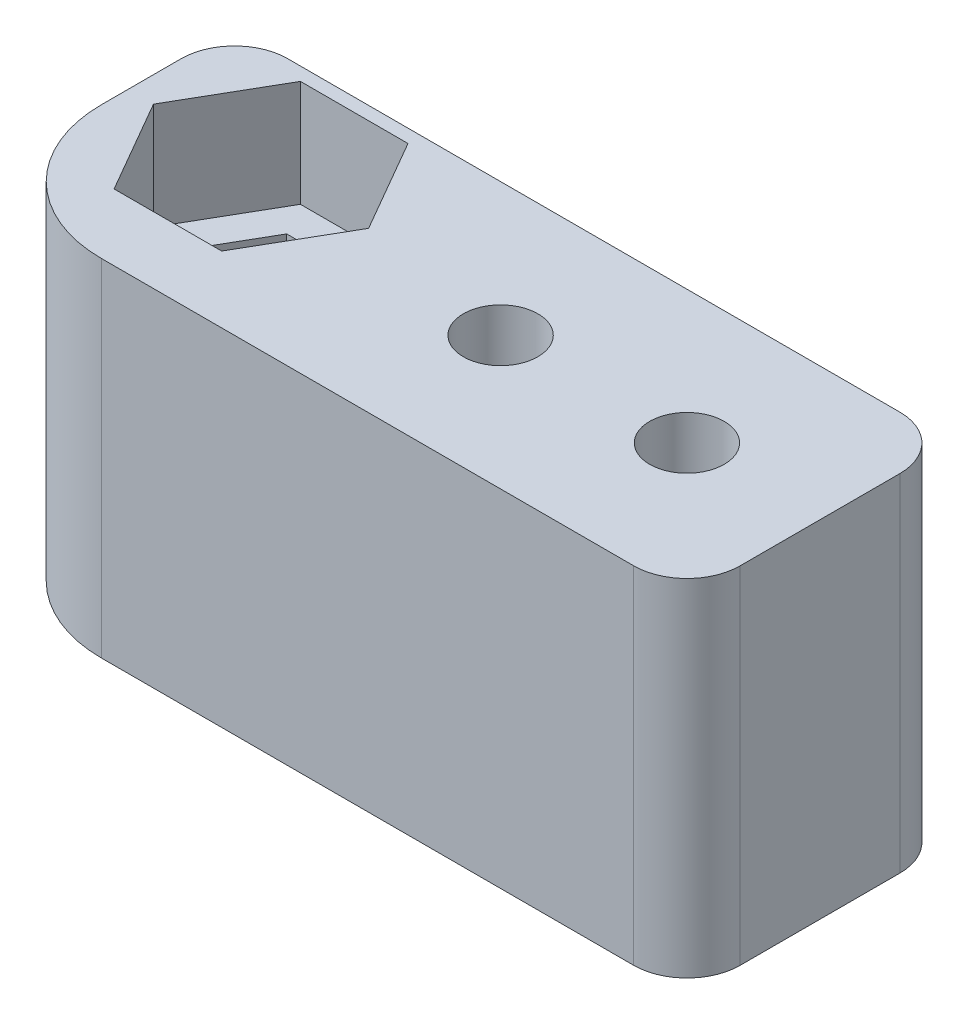
ISO-10303-21;
HEADER;
FILE_DESCRIPTION(('STEP AP214'),'2;1');
FILE_NAME('part.step','',(''),(''),'','','');
FILE_SCHEMA(('AUTOMOTIVE_DESIGN { 1 0 10303 214 1 1 1 1 }'));
ENDSEC;
DATA;
#1=APPLICATION_CONTEXT('core data for automotive mechanical design processes');
#2=APPLICATION_PROTOCOL_DEFINITION('international standard','automotive_design',2000,#1);
#3=PRODUCT_CONTEXT('',#1,'mechanical');
#4=PRODUCT('Part','Part','',(#3));
#5=PRODUCT_RELATED_PRODUCT_CATEGORY('part','',(#4));
#6=PRODUCT_DEFINITION_FORMATION('','',#4);
#7=PRODUCT_DEFINITION_CONTEXT('part definition',#1,'design');
#8=PRODUCT_DEFINITION('design','',#6,#7);
#9=PRODUCT_DEFINITION_SHAPE('','',#8);
#10=(LENGTH_UNIT() NAMED_UNIT(*) SI_UNIT(.MILLI.,.METRE.));
#11=(NAMED_UNIT(*) PLANE_ANGLE_UNIT() SI_UNIT($,.RADIAN.));
#12=(NAMED_UNIT(*) SI_UNIT($,.STERADIAN.) SOLID_ANGLE_UNIT());
#13=UNCERTAINTY_MEASURE_WITH_UNIT(LENGTH_MEASURE(1.E-05),#10,'distance_accuracy_value','');
#14=(GEOMETRIC_REPRESENTATION_CONTEXT(3) GLOBAL_UNCERTAINTY_ASSIGNED_CONTEXT((#13)) GLOBAL_UNIT_ASSIGNED_CONTEXT((#10,
#11,#12)) REPRESENTATION_CONTEXT('',''));
#15=CARTESIAN_POINT('',(0.,0.,0.));
#16=DIRECTION('',(0.,0.,1.));
#17=DIRECTION('',(1.,0.,0.));
#18=AXIS2_PLACEMENT_3D('',#15,#16,#17);
#19=CARTESIAN_POINT('',(-12.7,16.51,-1.27));
#20=DIRECTION('',(0.,-1.,0.));
#21=DIRECTION('',(0.,0.,-1.));
#22=AXIS2_PLACEMENT_3D('',#19,#20,#21);
#23=CYLINDRICAL_SURFACE('',#22,2.286);
#24=CARTESIAN_POINT('',(-12.7,0.,-1.27));
#25=DIRECTION('',(0.,1.,0.));
#26=DIRECTION('',(0.,0.,1.));
#27=AXIS2_PLACEMENT_3D('',#24,#25,#26);
#28=CIRCLE('',#27,2.286);
#29=CARTESIAN_POINT('',(-12.7,0.,1.016));
#30=VERTEX_POINT('',#29);
#31=EDGE_CURVE('E318',#30,#30,#28,.T.);
#32=ORIENTED_EDGE('',*,*,#31,.F.);
#33=EDGE_LOOP('',(#32));
#34=FACE_BOUND('',#33,.T.);
#35=CARTESIAN_POINT('',(-12.7,2.54,-1.27));
#36=DIRECTION('',(0.,1.,0.));
#37=DIRECTION('',(0.,0.,1.));
#38=AXIS2_PLACEMENT_3D('',#35,#36,#37);
#39=CIRCLE('',#38,2.286);
#40=CARTESIAN_POINT('',(-12.7,2.54,1.016));
#41=VERTEX_POINT('',#40);
#42=EDGE_CURVE('E49',#41,#41,#39,.T.);
#43=ORIENTED_EDGE('',*,*,#42,.T.);
#44=EDGE_LOOP('',(#43));
#45=FACE_BOUND('',#44,.T.);
#46=ADVANCED_FACE('F45',(#34,#45),#23,.F.);
#47=CARTESIAN_POINT('',(0.,16.51,0.));
#48=DIRECTION('',(0.,1.,0.));
#49=DIRECTION('',(0.,0.,1.));
#50=AXIS2_PLACEMENT_3D('',#47,#48,#49);
#51=PLANE('',#50);
#52=DIRECTION('',(0.5,0.,-0.866025403784439));
#53=VECTOR('',#52,1.);
#54=CARTESIAN_POINT('',(-10.1336780534521,16.51,3.175));
#55=LINE('',#54,#53);
#56=CARTESIAN_POINT('',(-10.1336780534521,16.51,3.175));
#57=VERTEX_POINT('',#56);
#58=CARTESIAN_POINT('',(-7.56735610690422,16.51,-1.27));
#59=VERTEX_POINT('',#58);
#60=EDGE_CURVE('E70',#57,#59,#55,.T.);
#61=ORIENTED_EDGE('',*,*,#60,.F.);
#62=DIRECTION('',(1.,0.,0.));
#63=VECTOR('',#62,1.);
#64=CARTESIAN_POINT('',(-15.2663219465479,16.51,3.175));
#65=LINE('',#64,#63);
#66=CARTESIAN_POINT('',(-15.2663219465479,16.51,3.175));
#67=VERTEX_POINT('',#66);
#68=EDGE_CURVE('E246',#67,#57,#65,.T.);
#69=ORIENTED_EDGE('',*,*,#68,.F.);
#70=DIRECTION('',(0.5,0.,0.866025403784439));
#71=VECTOR('',#70,1.);
#72=CARTESIAN_POINT('',(-17.8326438930958,16.51,-1.27));
#73=LINE('',#72,#71);
#74=CARTESIAN_POINT('',(-17.8326438930958,16.51,-1.27));
#75=VERTEX_POINT('',#74);
#76=EDGE_CURVE('E281',#75,#67,#73,.T.);
#77=ORIENTED_EDGE('',*,*,#76,.F.);
#78=DIRECTION('',(-0.5,0.,0.866025403784439));
#79=VECTOR('',#78,1.);
#80=CARTESIAN_POINT('',(-15.2663219465479,16.51,-5.715));
#81=LINE('',#80,#79);
#82=CARTESIAN_POINT('',(-15.2663219465479,16.51,-5.715));
#83=VERTEX_POINT('',#82);
#84=EDGE_CURVE('E277',#83,#75,#81,.T.);
#85=ORIENTED_EDGE('',*,*,#84,.F.);
#86=DIRECTION('',(-1.,0.,0.));
#87=VECTOR('',#86,1.);
#88=CARTESIAN_POINT('',(-10.1336780534521,16.51,-5.715));
#89=LINE('',#88,#87);
#90=CARTESIAN_POINT('',(-10.1336780534521,16.51,-5.715));
#91=VERTEX_POINT('',#90);
#92=EDGE_CURVE('E273',#91,#83,#89,.T.);
#93=ORIENTED_EDGE('',*,*,#92,.F.);
#94=DIRECTION('',(-0.5,0.,-0.866025403784439));
#95=VECTOR('',#94,1.);
#96=CARTESIAN_POINT('',(-7.56735610690422,16.51,-1.27));
#97=LINE('',#96,#95);
#98=EDGE_CURVE('E269',#59,#91,#97,.T.);
#99=ORIENTED_EDGE('',*,*,#98,.F.);
#100=EDGE_LOOP('',(#61,#69,#77,#85,#93,#99));
#101=FACE_BOUND('',#100,.T.);
#102=CARTESIAN_POINT('',(0.,16.51,0.));
#103=DIRECTION('',(0.,1.,0.));
#104=DIRECTION('',(0.,0.,1.));
#105=AXIS2_PLACEMENT_3D('',#102,#103,#104);
#106=CIRCLE('',#105,1.778);
#107=CARTESIAN_POINT('',(0.,16.51,1.778));
#108=VERTEX_POINT('',#107);
#109=EDGE_CURVE('E314',#108,#108,#106,.T.);
#110=ORIENTED_EDGE('',*,*,#109,.F.);
#111=EDGE_LOOP('',(#110));
#112=FACE_BOUND('',#111,.T.);
#113=DIRECTION('',(0.,0.,1.));
#114=VECTOR('',#113,1.);
#115=CARTESIAN_POINT('',(-19.05,16.51,-6.35));
#116=LINE('',#115,#114);
#117=CARTESIAN_POINT('',(-19.05,16.51,-3.81));
#118=VERTEX_POINT('',#117);
#119=CARTESIAN_POINT('',(-19.05,16.51,0.));
#120=VERTEX_POINT('',#119);
#121=EDGE_CURVE('E326',#118,#120,#116,.T.);
#122=ORIENTED_EDGE('',*,*,#121,.T.);
#123=CARTESIAN_POINT('',(-12.7,16.51,0.));
#124=DIRECTION('',(0.,1.,0.));
#125=DIRECTION('',(0.,0.,1.));
#126=AXIS2_PLACEMENT_3D('',#123,#124,#125);
#127=CIRCLE('',#126,6.35);
#128=CARTESIAN_POINT('',(-12.7,16.51,6.35));
#129=VERTEX_POINT('',#128);
#130=EDGE_CURVE('E12',#120,#129,#127,.T.);
#131=ORIENTED_EDGE('',*,*,#130,.T.);
#132=DIRECTION('',(1.,0.,0.));
#133=VECTOR('',#132,1.);
#134=CARTESIAN_POINT('',(-19.05,16.51,6.35));
#135=LINE('',#134,#133);
#136=CARTESIAN_POINT('',(12.7,16.51,6.35));
#137=VERTEX_POINT('',#136);
#138=EDGE_CURVE('E330',#129,#137,#135,.T.);
#139=ORIENTED_EDGE('',*,*,#138,.T.);
#140=CARTESIAN_POINT('',(12.7,16.51,3.81));
#141=DIRECTION('',(0.,1.,0.));
#142=DIRECTION('',(0.,0.,1.));
#143=AXIS2_PLACEMENT_3D('',#140,#141,#142);
#144=CIRCLE('',#143,2.54);
#145=CARTESIAN_POINT('',(15.24,16.51,3.81));
#146=VERTEX_POINT('',#145);
#147=EDGE_CURVE('E376',#137,#146,#144,.T.);
#148=ORIENTED_EDGE('',*,*,#147,.T.);
#149=DIRECTION('',(0.,0.,-1.));
#150=VECTOR('',#149,1.);
#151=CARTESIAN_POINT('',(15.24,16.51,-6.35));
#152=LINE('',#151,#150);
#153=CARTESIAN_POINT('',(15.24,16.51,-3.81));
#154=VERTEX_POINT('',#153);
#155=EDGE_CURVE('E334',#146,#154,#152,.T.);
#156=ORIENTED_EDGE('',*,*,#155,.T.);
#157=CARTESIAN_POINT('',(12.7,16.51,-3.81));
#158=DIRECTION('',(0.,1.,0.));
#159=DIRECTION('',(0.,0.,1.));
#160=AXIS2_PLACEMENT_3D('',#157,#158,#159);
#161=CIRCLE('',#160,2.54);
#162=CARTESIAN_POINT('',(12.7,16.51,-6.35));
#163=VERTEX_POINT('',#162);
#164=EDGE_CURVE('E379',#154,#163,#161,.T.);
#165=ORIENTED_EDGE('',*,*,#164,.T.);
#166=DIRECTION('',(-1.,0.,0.));
#167=VECTOR('',#166,1.);
#168=CARTESIAN_POINT('',(-19.05,16.51,-6.35));
#169=LINE('',#168,#167);
#170=CARTESIAN_POINT('',(-16.51,16.51,-6.35));
#171=VERTEX_POINT('',#170);
#172=EDGE_CURVE('E338',#163,#171,#169,.T.);
#173=ORIENTED_EDGE('',*,*,#172,.T.);
#174=CARTESIAN_POINT('',(-16.51,16.51,-3.81));
#175=DIRECTION('',(0.,1.,0.));
#176=DIRECTION('',(0.,0.,1.));
#177=AXIS2_PLACEMENT_3D('',#174,#175,#176);
#178=CIRCLE('',#177,2.54);
#179=EDGE_CURVE('E382',#171,#118,#178,.T.);
#180=ORIENTED_EDGE('',*,*,#179,.T.);
#181=EDGE_LOOP('',(#122,#131,#139,#148,#156,#165,#173,#180));
#182=FACE_BOUND('',#181,.T.);
#183=CARTESIAN_POINT('',(8.89,16.51,0.));
#184=DIRECTION('',(0.,1.,0.));
#185=DIRECTION('',(0.,0.,1.));
#186=AXIS2_PLACEMENT_3D('',#183,#184,#185);
#187=CIRCLE('',#186,1.778);
#188=CARTESIAN_POINT('',(8.89,16.51,1.778));
#189=VERTEX_POINT('',#188);
#190=EDGE_CURVE('E306',#189,#189,#187,.T.);
#191=ORIENTED_EDGE('',*,*,#190,.F.);
#192=EDGE_LOOP('',(#191));
#193=FACE_BOUND('',#192,.T.);
#194=ADVANCED_FACE('F413',(#101,#112,#182,#193),#51,.T.);
#195=CARTESIAN_POINT('',(0.,0.,0.));
#196=DIRECTION('',(0.,1.,0.));
#197=DIRECTION('',(0.,0.,1.));
#198=AXIS2_PLACEMENT_3D('',#195,#196,#197);
#199=PLANE('',#198);
#200=DIRECTION('',(1.,0.,0.));
#201=VECTOR('',#200,1.);
#202=CARTESIAN_POINT('',(-19.05,0.,6.35));
#203=LINE('',#202,#201);
#204=CARTESIAN_POINT('',(-12.7,0.,6.35));
#205=VERTEX_POINT('',#204);
#206=CARTESIAN_POINT('',(12.7,0.,6.35));
#207=VERTEX_POINT('',#206);
#208=EDGE_CURVE('E346',#205,#207,#203,.T.);
#209=ORIENTED_EDGE('',*,*,#208,.F.);
#210=CARTESIAN_POINT('',(-12.7,0.,0.));
#211=DIRECTION('',(0.,1.,0.));
#212=DIRECTION('',(0.,0.,1.));
#213=AXIS2_PLACEMENT_3D('',#210,#211,#212);
#214=CIRCLE('',#213,6.35);
#215=CARTESIAN_POINT('',(-19.05,0.,0.));
#216=VERTEX_POINT('',#215);
#217=EDGE_CURVE('E400',#205,#216,#214,.F.);
#218=ORIENTED_EDGE('',*,*,#217,.T.);
#219=DIRECTION('',(0.,0.,1.));
#220=VECTOR('',#219,1.);
#221=CARTESIAN_POINT('',(-19.05,0.,-6.35));
#222=LINE('',#221,#220);
#223=CARTESIAN_POINT('',(-19.05,0.,-3.81));
#224=VERTEX_POINT('',#223);
#225=EDGE_CURVE('E325',#224,#216,#222,.T.);
#226=ORIENTED_EDGE('',*,*,#225,.F.);
#227=CARTESIAN_POINT('',(-16.51,0.,-3.81));
#228=DIRECTION('',(0.,1.,0.));
#229=DIRECTION('',(0.,0.,1.));
#230=AXIS2_PLACEMENT_3D('',#227,#228,#229);
#231=CIRCLE('',#230,2.54);
#232=CARTESIAN_POINT('',(-16.51,0.,-6.35));
#233=VERTEX_POINT('',#232);
#234=EDGE_CURVE('E366',#224,#233,#231,.F.);
#235=ORIENTED_EDGE('',*,*,#234,.T.);
#236=DIRECTION('',(-1.,0.,0.));
#237=VECTOR('',#236,1.);
#238=CARTESIAN_POINT('',(-19.05,0.,-6.35));
#239=LINE('',#238,#237);
#240=CARTESIAN_POINT('',(12.7,0.,-6.35));
#241=VERTEX_POINT('',#240);
#242=EDGE_CURVE('E331',#241,#233,#239,.T.);
#243=ORIENTED_EDGE('',*,*,#242,.F.);
#244=CARTESIAN_POINT('',(12.7,0.,-3.81));
#245=DIRECTION('',(0.,1.,0.));
#246=DIRECTION('',(0.,0.,1.));
#247=AXIS2_PLACEMENT_3D('',#244,#245,#246);
#248=CIRCLE('',#247,2.54);
#249=CARTESIAN_POINT('',(15.24,0.,-3.81));
#250=VERTEX_POINT('',#249);
#251=EDGE_CURVE('E363',#241,#250,#248,.F.);
#252=ORIENTED_EDGE('',*,*,#251,.T.);
#253=DIRECTION('',(0.,0.,-1.));
#254=VECTOR('',#253,1.);
#255=CARTESIAN_POINT('',(15.24,0.,-6.35));
#256=LINE('',#255,#254);
#257=CARTESIAN_POINT('',(15.24,0.,3.81));
#258=VERTEX_POINT('',#257);
#259=EDGE_CURVE('E349',#258,#250,#256,.T.);
#260=ORIENTED_EDGE('',*,*,#259,.F.);
#261=CARTESIAN_POINT('',(12.7,0.,3.81));
#262=DIRECTION('',(0.,1.,0.));
#263=DIRECTION('',(0.,0.,1.));
#264=AXIS2_PLACEMENT_3D('',#261,#262,#263);
#265=CIRCLE('',#264,2.54);
#266=EDGE_CURVE('E359',#258,#207,#265,.F.);
#267=ORIENTED_EDGE('',*,*,#266,.T.);
#268=EDGE_LOOP('',(#209,#218,#226,#235,#243,#252,#260,#267));
#269=FACE_BOUND('',#268,.T.);
#270=ORIENTED_EDGE('',*,*,#31,.T.);
#271=EDGE_LOOP('',(#270));
#272=FACE_BOUND('',#271,.T.);
#273=CARTESIAN_POINT('',(0.,0.,0.));
#274=DIRECTION('',(0.,1.,0.));
#275=DIRECTION('',(0.,0.,1.));
#276=AXIS2_PLACEMENT_3D('',#273,#274,#275);
#277=CIRCLE('',#276,1.778);
#278=CARTESIAN_POINT('',(0.,0.,1.778));
#279=VERTEX_POINT('',#278);
#280=EDGE_CURVE('E310',#279,#279,#277,.T.);
#281=ORIENTED_EDGE('',*,*,#280,.T.);
#282=EDGE_LOOP('',(#281));
#283=FACE_BOUND('',#282,.T.);
#284=CARTESIAN_POINT('',(8.89,0.,0.));
#285=DIRECTION('',(0.,1.,0.));
#286=DIRECTION('',(0.,0.,1.));
#287=AXIS2_PLACEMENT_3D('',#284,#285,#286);
#288=CIRCLE('',#287,1.778);
#289=CARTESIAN_POINT('',(8.89,0.,1.778));
#290=VERTEX_POINT('',#289);
#291=EDGE_CURVE('E291',#290,#290,#288,.T.);
#292=ORIENTED_EDGE('',*,*,#291,.T.);
#293=EDGE_LOOP('',(#292));
#294=FACE_BOUND('',#293,.T.);
#295=ADVANCED_FACE('F422',(#269,#272,#283,#294),#199,.F.);
#296=CARTESIAN_POINT('',(-19.05,16.51,-6.35));
#297=DIRECTION('',(1.,0.,0.));
#298=DIRECTION('',(0.,0.,-1.));
#299=AXIS2_PLACEMENT_3D('',#296,#297,#298);
#300=PLANE('',#299);
#301=ORIENTED_EDGE('',*,*,#225,.T.);
#302=DIRECTION('',(0.,-1.,0.));
#303=VECTOR('',#302,1.);
#304=CARTESIAN_POINT('',(-19.05,16.51,0.));
#305=LINE('',#304,#303);
#306=EDGE_CURVE('E55',#216,#120,#305,.F.);
#307=ORIENTED_EDGE('',*,*,#306,.T.);
#308=ORIENTED_EDGE('',*,*,#121,.F.);
#309=DIRECTION('',(0.,-1.,0.));
#310=VECTOR('',#309,1.);
#311=CARTESIAN_POINT('',(-19.05,16.51,-3.81));
#312=LINE('',#311,#310);
#313=EDGE_CURVE('E342',#118,#224,#312,.T.);
#314=ORIENTED_EDGE('',*,*,#313,.T.);
#315=EDGE_LOOP('',(#301,#307,#308,#314));
#316=FACE_BOUND('',#315,.T.);
#317=ADVANCED_FACE('F407',(#316),#300,.F.);
#318=CARTESIAN_POINT('',(-19.05,16.51,6.35));
#319=DIRECTION('',(0.,0.,-1.));
#320=DIRECTION('',(-1.,0.,0.));
#321=AXIS2_PLACEMENT_3D('',#318,#319,#320);
#322=PLANE('',#321);
#323=ORIENTED_EDGE('',*,*,#138,.F.);
#324=DIRECTION('',(0.,-1.,0.));
#325=VECTOR('',#324,1.);
#326=CARTESIAN_POINT('',(-12.7,16.51,6.35));
#327=LINE('',#326,#325);
#328=EDGE_CURVE('E396',#129,#205,#327,.T.);
#329=ORIENTED_EDGE('',*,*,#328,.T.);
#330=ORIENTED_EDGE('',*,*,#208,.T.);
#331=DIRECTION('',(0.,-1.,0.));
#332=VECTOR('',#331,1.);
#333=CARTESIAN_POINT('',(12.7,16.51,6.35));
#334=LINE('',#333,#332);
#335=EDGE_CURVE('E392',#207,#137,#334,.F.);
#336=ORIENTED_EDGE('',*,*,#335,.T.);
#337=EDGE_LOOP('',(#323,#329,#330,#336));
#338=FACE_BOUND('',#337,.T.);
#339=ADVANCED_FACE('F420',(#338),#322,.F.);
#340=CARTESIAN_POINT('',(15.24,16.51,-6.35));
#341=DIRECTION('',(-1.,0.,0.));
#342=DIRECTION('',(0.,0.,1.));
#343=AXIS2_PLACEMENT_3D('',#340,#341,#342);
#344=PLANE('',#343);
#345=ORIENTED_EDGE('',*,*,#259,.T.);
#346=DIRECTION('',(0.,-1.,0.));
#347=VECTOR('',#346,1.);
#348=CARTESIAN_POINT('',(15.24,16.51,-3.81));
#349=LINE('',#348,#347);
#350=EDGE_CURVE('E389',#250,#154,#349,.F.);
#351=ORIENTED_EDGE('',*,*,#350,.T.);
#352=ORIENTED_EDGE('',*,*,#155,.F.);
#353=DIRECTION('',(0.,-1.,0.));
#354=VECTOR('',#353,1.);
#355=CARTESIAN_POINT('',(15.24,16.51,3.81));
#356=LINE('',#355,#354);
#357=EDGE_CURVE('E385',#146,#258,#356,.T.);
#358=ORIENTED_EDGE('',*,*,#357,.T.);
#359=EDGE_LOOP('',(#345,#351,#352,#358));
#360=FACE_BOUND('',#359,.T.);
#361=ADVANCED_FACE('F433',(#360),#344,.F.);
#362=CARTESIAN_POINT('',(-19.05,16.51,-6.35));
#363=DIRECTION('',(0.,0.,1.));
#364=DIRECTION('',(1.,0.,0.));
#365=AXIS2_PLACEMENT_3D('',#362,#363,#364);
#366=PLANE('',#365);
#367=ORIENTED_EDGE('',*,*,#242,.T.);
#368=DIRECTION('',(0.,-1.,0.));
#369=VECTOR('',#368,1.);
#370=CARTESIAN_POINT('',(-16.51,16.51,-6.35));
#371=LINE('',#370,#369);
#372=EDGE_CURVE('E373',#233,#171,#371,.F.);
#373=ORIENTED_EDGE('',*,*,#372,.T.);
#374=ORIENTED_EDGE('',*,*,#172,.F.);
#375=DIRECTION('',(0.,-1.,0.));
#376=VECTOR('',#375,1.);
#377=CARTESIAN_POINT('',(12.7,16.51,-6.35));
#378=LINE('',#377,#376);
#379=EDGE_CURVE('E369',#163,#241,#378,.T.);
#380=ORIENTED_EDGE('',*,*,#379,.T.);
#381=EDGE_LOOP('',(#367,#373,#374,#380));
#382=FACE_BOUND('',#381,.T.);
#383=ADVANCED_FACE('F440',(#382),#366,.F.);
#384=CARTESIAN_POINT('',(0.,16.51,0.));
#385=DIRECTION('',(0.,-1.,0.));
#386=DIRECTION('',(0.,0.,-1.));
#387=AXIS2_PLACEMENT_3D('',#384,#385,#386);
#388=CYLINDRICAL_SURFACE('',#387,1.778);
#389=ORIENTED_EDGE('',*,*,#109,.T.);
#390=EDGE_LOOP('',(#389));
#391=FACE_BOUND('',#390,.T.);
#392=ORIENTED_EDGE('',*,*,#280,.F.);
#393=EDGE_LOOP('',(#392));
#394=FACE_BOUND('',#393,.T.);
#395=ADVANCED_FACE('F453',(#391,#394),#388,.F.);
#396=CARTESIAN_POINT('',(8.89,16.51,0.));
#397=DIRECTION('',(0.,-1.,0.));
#398=DIRECTION('',(0.,0.,-1.));
#399=AXIS2_PLACEMENT_3D('',#396,#397,#398);
#400=CYLINDRICAL_SURFACE('',#399,1.778);
#401=ORIENTED_EDGE('',*,*,#190,.T.);
#402=EDGE_LOOP('',(#401));
#403=FACE_BOUND('',#402,.T.);
#404=ORIENTED_EDGE('',*,*,#291,.F.);
#405=EDGE_LOOP('',(#404));
#406=FACE_BOUND('',#405,.T.);
#407=ADVANCED_FACE('F446',(#403,#406),#400,.F.);
#408=CARTESIAN_POINT('',(-16.51,16.51,-3.81));
#409=DIRECTION('',(0.,-1.,0.));
#410=DIRECTION('',(0.,0.,-1.));
#411=AXIS2_PLACEMENT_3D('',#408,#409,#410);
#412=CYLINDRICAL_SURFACE('',#411,2.54);
#413=ORIENTED_EDGE('',*,*,#179,.F.);
#414=ORIENTED_EDGE('',*,*,#372,.F.);
#415=ORIENTED_EDGE('',*,*,#234,.F.);
#416=ORIENTED_EDGE('',*,*,#313,.F.);
#417=EDGE_LOOP('',(#413,#414,#415,#416));
#418=FACE_BOUND('',#417,.T.);
#419=ADVANCED_FACE('F444',(#418),#412,.T.);
#420=CARTESIAN_POINT('',(12.7,16.51,-3.81));
#421=DIRECTION('',(0.,-1.,0.));
#422=DIRECTION('',(0.,0.,-1.));
#423=AXIS2_PLACEMENT_3D('',#420,#421,#422);
#424=CYLINDRICAL_SURFACE('',#423,2.54);
#425=ORIENTED_EDGE('',*,*,#164,.F.);
#426=ORIENTED_EDGE('',*,*,#350,.F.);
#427=ORIENTED_EDGE('',*,*,#251,.F.);
#428=ORIENTED_EDGE('',*,*,#379,.F.);
#429=EDGE_LOOP('',(#425,#426,#427,#428));
#430=FACE_BOUND('',#429,.T.);
#431=ADVANCED_FACE('F436',(#430),#424,.T.);
#432=CARTESIAN_POINT('',(12.7,16.51,3.81));
#433=DIRECTION('',(0.,-1.,0.));
#434=DIRECTION('',(0.,0.,-1.));
#435=AXIS2_PLACEMENT_3D('',#432,#433,#434);
#436=CYLINDRICAL_SURFACE('',#435,2.54);
#437=ORIENTED_EDGE('',*,*,#147,.F.);
#438=ORIENTED_EDGE('',*,*,#335,.F.);
#439=ORIENTED_EDGE('',*,*,#266,.F.);
#440=ORIENTED_EDGE('',*,*,#357,.F.);
#441=EDGE_LOOP('',(#437,#438,#439,#440));
#442=FACE_BOUND('',#441,.T.);
#443=ADVANCED_FACE('F429',(#442),#436,.T.);
#444=CARTESIAN_POINT('',(-12.7,16.51,0.));
#445=DIRECTION('',(0.,-1.,0.));
#446=DIRECTION('',(0.,0.,-1.));
#447=AXIS2_PLACEMENT_3D('',#444,#445,#446);
#448=CYLINDRICAL_SURFACE('',#447,6.35);
#449=ORIENTED_EDGE('',*,*,#130,.F.);
#450=ORIENTED_EDGE('',*,*,#306,.F.);
#451=ORIENTED_EDGE('',*,*,#217,.F.);
#452=ORIENTED_EDGE('',*,*,#328,.F.);
#453=EDGE_LOOP('',(#449,#450,#451,#452));
#454=FACE_BOUND('',#453,.T.);
#455=ADVANCED_FACE('F47',(#454),#448,.T.);
#456=CARTESIAN_POINT('',(-10.1336780534521,11.43,3.175));
#457=DIRECTION('',(0.866025403784439,0.,0.5));
#458=DIRECTION('',(0.5,0.,-0.866025403784439));
#459=AXIS2_PLACEMENT_3D('',#456,#457,#458);
#460=PLANE('',#459);
#461=ORIENTED_EDGE('',*,*,#60,.T.);
#462=DIRECTION('',(0.,1.,0.));
#463=VECTOR('',#462,1.);
#464=CARTESIAN_POINT('',(-7.56735610690422,11.43,-1.27));
#465=LINE('',#464,#463);
#466=CARTESIAN_POINT('',(-7.56735610690422,11.43,-1.27));
#467=VERTEX_POINT('',#466);
#468=EDGE_CURVE('E266',#467,#59,#465,.T.);
#469=ORIENTED_EDGE('',*,*,#468,.F.);
#470=DIRECTION('',(0.5,0.,-0.866025403784439));
#471=VECTOR('',#470,1.);
#472=CARTESIAN_POINT('',(-10.1336780534521,11.43,3.175));
#473=LINE('',#472,#471);
#474=CARTESIAN_POINT('',(-10.1336780534521,11.43,3.175));
#475=VERTEX_POINT('',#474);
#476=EDGE_CURVE('E241',#475,#467,#473,.T.);
#477=ORIENTED_EDGE('',*,*,#476,.F.);
#478=DIRECTION('',(0.,1.,0.));
#479=VECTOR('',#478,1.);
#480=CARTESIAN_POINT('',(-10.1336780534521,11.43,3.175));
#481=LINE('',#480,#479);
#482=EDGE_CURVE('E288',#475,#57,#481,.T.);
#483=ORIENTED_EDGE('',*,*,#482,.T.);
#484=EDGE_LOOP('',(#461,#469,#477,#483));
#485=FACE_BOUND('',#484,.T.);
#486=ADVANCED_FACE('F540',(#485),#460,.F.);
#487=CARTESIAN_POINT('',(-15.2663219465479,11.43,3.175));
#488=DIRECTION('',(0.,0.,1.));
#489=DIRECTION('',(1.,0.,0.));
#490=AXIS2_PLACEMENT_3D('',#487,#488,#489);
#491=PLANE('',#490);
#492=ORIENTED_EDGE('',*,*,#68,.T.);
#493=ORIENTED_EDGE('',*,*,#482,.F.);
#494=DIRECTION('',(1.,0.,0.));
#495=VECTOR('',#494,1.);
#496=CARTESIAN_POINT('',(-15.2663219465479,11.43,3.175));
#497=LINE('',#496,#495);
#498=CARTESIAN_POINT('',(-15.2663219465479,11.43,3.175));
#499=VERTEX_POINT('',#498);
#500=EDGE_CURVE('E262',#499,#475,#497,.T.);
#501=ORIENTED_EDGE('',*,*,#500,.F.);
#502=DIRECTION('',(0.,1.,0.));
#503=VECTOR('',#502,1.);
#504=CARTESIAN_POINT('',(-15.2663219465479,11.43,3.175));
#505=LINE('',#504,#503);
#506=EDGE_CURVE('E292',#499,#67,#505,.T.);
#507=ORIENTED_EDGE('',*,*,#506,.T.);
#508=EDGE_LOOP('',(#492,#493,#501,#507));
#509=FACE_BOUND('',#508,.T.);
#510=ADVANCED_FACE('F550',(#509),#491,.F.);
#511=CARTESIAN_POINT('',(-17.8326438930958,11.43,-1.27));
#512=DIRECTION('',(-0.866025403784439,0.,0.5));
#513=DIRECTION('',(0.5,0.,0.866025403784439));
#514=AXIS2_PLACEMENT_3D('',#511,#512,#513);
#515=PLANE('',#514);
#516=ORIENTED_EDGE('',*,*,#76,.T.);
#517=ORIENTED_EDGE('',*,*,#506,.F.);
#518=DIRECTION('',(0.5,0.,0.866025403784439));
#519=VECTOR('',#518,1.);
#520=CARTESIAN_POINT('',(-17.8326438930958,11.43,-1.27));
#521=LINE('',#520,#519);
#522=CARTESIAN_POINT('',(-17.8326438930958,11.43,-1.27));
#523=VERTEX_POINT('',#522);
#524=EDGE_CURVE('E258',#523,#499,#521,.T.);
#525=ORIENTED_EDGE('',*,*,#524,.F.);
#526=DIRECTION('',(0.,1.,0.));
#527=VECTOR('',#526,1.);
#528=CARTESIAN_POINT('',(-17.8326438930958,11.43,-1.27));
#529=LINE('',#528,#527);
#530=EDGE_CURVE('E295',#523,#75,#529,.T.);
#531=ORIENTED_EDGE('',*,*,#530,.T.);
#532=EDGE_LOOP('',(#516,#517,#525,#531));
#533=FACE_BOUND('',#532,.T.);
#534=ADVANCED_FACE('F560',(#533),#515,.F.);
#535=CARTESIAN_POINT('',(-15.2663219465479,11.43,-5.715));
#536=DIRECTION('',(-0.866025403784439,0.,-0.5));
#537=DIRECTION('',(-0.5,0.,0.866025403784439));
#538=AXIS2_PLACEMENT_3D('',#535,#536,#537);
#539=PLANE('',#538);
#540=ORIENTED_EDGE('',*,*,#84,.T.);
#541=ORIENTED_EDGE('',*,*,#530,.F.);
#542=DIRECTION('',(-0.5,0.,0.866025403784439));
#543=VECTOR('',#542,1.);
#544=CARTESIAN_POINT('',(-15.2663219465479,11.43,-5.715));
#545=LINE('',#544,#543);
#546=CARTESIAN_POINT('',(-15.2663219465479,11.43,-5.715));
#547=VERTEX_POINT('',#546);
#548=EDGE_CURVE('E254',#547,#523,#545,.T.);
#549=ORIENTED_EDGE('',*,*,#548,.F.);
#550=DIRECTION('',(0.,1.,0.));
#551=VECTOR('',#550,1.);
#552=CARTESIAN_POINT('',(-15.2663219465479,11.43,-5.715));
#553=LINE('',#552,#551);
#554=EDGE_CURVE('E298',#547,#83,#553,.T.);
#555=ORIENTED_EDGE('',*,*,#554,.T.);
#556=EDGE_LOOP('',(#540,#541,#549,#555));
#557=FACE_BOUND('',#556,.T.);
#558=ADVANCED_FACE('F571',(#557),#539,.F.);
#559=CARTESIAN_POINT('',(-10.1336780534521,11.43,-5.715));
#560=DIRECTION('',(0.,0.,-1.));
#561=DIRECTION('',(-1.,0.,0.));
#562=AXIS2_PLACEMENT_3D('',#559,#560,#561);
#563=PLANE('',#562);
#564=ORIENTED_EDGE('',*,*,#92,.T.);
#565=ORIENTED_EDGE('',*,*,#554,.F.);
#566=DIRECTION('',(-1.,0.,0.));
#567=VECTOR('',#566,1.);
#568=CARTESIAN_POINT('',(-10.1336780534521,11.43,-5.715));
#569=LINE('',#568,#567);
#570=CARTESIAN_POINT('',(-10.1336780534521,11.43,-5.715));
#571=VERTEX_POINT('',#570);
#572=EDGE_CURVE('E250',#571,#547,#569,.T.);
#573=ORIENTED_EDGE('',*,*,#572,.F.);
#574=DIRECTION('',(0.,1.,0.));
#575=VECTOR('',#574,1.);
#576=CARTESIAN_POINT('',(-10.1336780534521,11.43,-5.715));
#577=LINE('',#576,#575);
#578=EDGE_CURVE('E301',#571,#91,#577,.T.);
#579=ORIENTED_EDGE('',*,*,#578,.T.);
#580=EDGE_LOOP('',(#564,#565,#573,#579));
#581=FACE_BOUND('',#580,.T.);
#582=ADVANCED_FACE('F582',(#581),#563,.F.);
#583=CARTESIAN_POINT('',(-7.56735610690422,11.43,-1.27));
#584=DIRECTION('',(0.866025403784439,0.,-0.5));
#585=DIRECTION('',(-0.5,0.,-0.866025403784439));
#586=AXIS2_PLACEMENT_3D('',#583,#584,#585);
#587=PLANE('',#586);
#588=ORIENTED_EDGE('',*,*,#98,.T.);
#589=ORIENTED_EDGE('',*,*,#578,.F.);
#590=DIRECTION('',(-0.5,0.,-0.866025403784439));
#591=VECTOR('',#590,1.);
#592=CARTESIAN_POINT('',(-7.56735610690422,11.43,-1.27));
#593=LINE('',#592,#591);
#594=EDGE_CURVE('E245',#467,#571,#593,.T.);
#595=ORIENTED_EDGE('',*,*,#594,.F.);
#596=ORIENTED_EDGE('',*,*,#468,.T.);
#597=EDGE_LOOP('',(#588,#589,#595,#596));
#598=FACE_BOUND('',#597,.T.);
#599=ADVANCED_FACE('F593',(#598),#587,.F.);
#600=CARTESIAN_POINT('',(0.,11.43,0.));
#601=DIRECTION('',(0.,1.,0.));
#602=DIRECTION('',(0.,0.,1.));
#603=AXIS2_PLACEMENT_3D('',#600,#601,#602);
#604=PLANE('',#603);
#605=DIRECTION('',(0.499999999999995,0.,-0.866025403784441));
#606=VECTOR('',#605,1.);
#607=CARTESIAN_POINT('',(-11.028219466856,11.43,1.62560882250998));
#608=LINE('',#607,#606);
#609=CARTESIAN_POINT('',(-11.028219466856,11.43,1.62560882250998));
#610=VERTEX_POINT('',#609);
#611=CARTESIAN_POINT('',(-9.35643893371199,11.43,-1.27));
#612=VERTEX_POINT('',#611);
#613=EDGE_CURVE('E62',#610,#612,#608,.T.);
#614=ORIENTED_EDGE('',*,*,#613,.F.);
#615=DIRECTION('',(1.,0.,0.));
#616=VECTOR('',#615,1.);
#617=CARTESIAN_POINT('',(-14.371780533144,11.43,1.62560882251002));
#618=LINE('',#617,#616);
#619=CARTESIAN_POINT('',(-14.371780533144,11.43,1.62560882251002));
#620=VERTEX_POINT('',#619);
#621=EDGE_CURVE('E220',#620,#610,#618,.T.);
#622=ORIENTED_EDGE('',*,*,#621,.F.);
#623=DIRECTION('',(0.500000000000007,0.,0.866025403784434));
#624=VECTOR('',#623,1.);
#625=CARTESIAN_POINT('',(-16.043561066288,11.43,-1.26999999999998));
#626=LINE('',#625,#624);
#627=CARTESIAN_POINT('',(-16.043561066288,11.43,-1.26999999999998));
#628=VERTEX_POINT('',#627);
#629=EDGE_CURVE('E213',#628,#620,#626,.T.);
#630=ORIENTED_EDGE('',*,*,#629,.F.);
#631=DIRECTION('',(-0.499999999999995,0.,0.866025403784442));
#632=VECTOR('',#631,1.);
#633=CARTESIAN_POINT('',(-14.371780533144,11.43,-4.16560882251));
#634=LINE('',#633,#632);
#635=CARTESIAN_POINT('',(-14.371780533144,11.43,-4.16560882251));
#636=VERTEX_POINT('',#635);
#637=EDGE_CURVE('E209',#636,#628,#634,.T.);
#638=ORIENTED_EDGE('',*,*,#637,.F.);
#639=DIRECTION('',(-1.,0.,0.));
#640=VECTOR('',#639,1.);
#641=CARTESIAN_POINT('',(-11.028219466856,11.43,-4.16560882251001));
#642=LINE('',#641,#640);
#643=CARTESIAN_POINT('',(-11.028219466856,11.43,-4.16560882251001));
#644=VERTEX_POINT('',#643);
#645=EDGE_CURVE('E189',#644,#636,#642,.T.);
#646=ORIENTED_EDGE('',*,*,#645,.F.);
#647=DIRECTION('',(-0.500000000000001,0.,-0.866025403784438));
#648=VECTOR('',#647,1.);
#649=CARTESIAN_POINT('',(-9.35643893371199,11.43,-1.27));
#650=LINE('',#649,#648);
#651=EDGE_CURVE('E200',#612,#644,#650,.T.);
#652=ORIENTED_EDGE('',*,*,#651,.F.);
#653=EDGE_LOOP('',(#614,#622,#630,#638,#646,#652));
#654=FACE_BOUND('',#653,.T.);
#655=ORIENTED_EDGE('',*,*,#476,.T.);
#656=ORIENTED_EDGE('',*,*,#594,.T.);
#657=ORIENTED_EDGE('',*,*,#572,.T.);
#658=ORIENTED_EDGE('',*,*,#548,.T.);
#659=ORIENTED_EDGE('',*,*,#524,.T.);
#660=ORIENTED_EDGE('',*,*,#500,.T.);
#661=EDGE_LOOP('',(#655,#656,#657,#658,#659,#660));
#662=FACE_BOUND('',#661,.T.);
#663=ADVANCED_FACE('F205',(#654,#662),#604,.T.);
#664=CARTESIAN_POINT('',(-11.028219466856,-8.84623107475604,1.62560882250998));
#665=DIRECTION('',(0.866025403784441,0.,0.499999999999995));
#666=DIRECTION('',(0.499999999999995,0.,-0.866025403784442));
#667=AXIS2_PLACEMENT_3D('',#664,#665,#666);
#668=PLANE('',#667);
#669=DIRECTION('',(-0.499999999999995,0.,0.866025403784442));
#670=VECTOR('',#669,1.);
#671=CARTESIAN_POINT('',(-11.028219466856,2.54,1.62560882250998));
#672=LINE('',#671,#670);
#673=CARTESIAN_POINT('',(-9.35643893371199,2.54,-1.27));
#674=VERTEX_POINT('',#673);
#675=CARTESIAN_POINT('',(-11.028219466856,2.54,1.62560882250998));
#676=VERTEX_POINT('',#675);
#677=EDGE_CURVE('E240',#674,#676,#672,.T.);
#678=ORIENTED_EDGE('',*,*,#677,.T.);
#679=DIRECTION('',(0.,1.,0.));
#680=VECTOR('',#679,1.);
#681=CARTESIAN_POINT('',(-11.028219466856,-8.84623107475604,1.62560882250998));
#682=LINE('',#681,#680);
#683=EDGE_CURVE('E224',#676,#610,#682,.T.);
#684=ORIENTED_EDGE('',*,*,#683,.T.);
#685=ORIENTED_EDGE('',*,*,#613,.T.);
#686=DIRECTION('',(0.,1.,0.));
#687=VECTOR('',#686,1.);
#688=CARTESIAN_POINT('',(-9.35643893371199,-8.84623107475604,-1.27));
#689=LINE('',#688,#687);
#690=EDGE_CURVE('E197',#674,#612,#689,.T.);
#691=ORIENTED_EDGE('',*,*,#690,.F.);
#692=EDGE_LOOP('',(#678,#684,#685,#691));
#693=FACE_BOUND('',#692,.T.);
#694=ADVANCED_FACE('F614',(#693),#668,.F.);
#695=CARTESIAN_POINT('',(-14.371780533144,-8.84623107475604,1.62560882251002));
#696=DIRECTION('',(0.,0.,1.));
#697=DIRECTION('',(1.,0.,0.));
#698=AXIS2_PLACEMENT_3D('',#695,#696,#697);
#699=PLANE('',#698);
#700=DIRECTION('',(-1.,0.,0.));
#701=VECTOR('',#700,1.);
#702=CARTESIAN_POINT('',(-14.371780533144,2.54,1.62560882251002));
#703=LINE('',#702,#701);
#704=CARTESIAN_POINT('',(-14.371780533144,2.54,1.62560882251002));
#705=VERTEX_POINT('',#704);
#706=EDGE_CURVE('E717',#676,#705,#703,.T.);
#707=ORIENTED_EDGE('',*,*,#706,.T.);
#708=DIRECTION('',(0.,1.,0.));
#709=VECTOR('',#708,1.);
#710=CARTESIAN_POINT('',(-14.371780533144,-8.84623107475604,1.62560882251002));
#711=LINE('',#710,#709);
#712=EDGE_CURVE('E227',#705,#620,#711,.T.);
#713=ORIENTED_EDGE('',*,*,#712,.T.);
#714=ORIENTED_EDGE('',*,*,#621,.T.);
#715=ORIENTED_EDGE('',*,*,#683,.F.);
#716=EDGE_LOOP('',(#707,#713,#714,#715));
#717=FACE_BOUND('',#716,.T.);
#718=ADVANCED_FACE('F630',(#717),#699,.F.);
#719=CARTESIAN_POINT('',(-16.043561066288,-8.84623107475604,-1.26999999999998));
#720=DIRECTION('',(-0.866025403784434,0.,0.500000000000007));
#721=DIRECTION('',(0.500000000000007,0.,0.866025403784435));
#722=AXIS2_PLACEMENT_3D('',#719,#720,#721);
#723=PLANE('',#722);
#724=DIRECTION('',(-0.500000000000007,0.,-0.866025403784435));
#725=VECTOR('',#724,1.);
#726=CARTESIAN_POINT('',(-16.043561066288,2.54,-1.26999999999998));
#727=LINE('',#726,#725);
#728=CARTESIAN_POINT('',(-16.043561066288,2.54,-1.26999999999998));
#729=VERTEX_POINT('',#728);
#730=EDGE_CURVE('E722',#705,#729,#727,.T.);
#731=ORIENTED_EDGE('',*,*,#730,.T.);
#732=DIRECTION('',(0.,1.,0.));
#733=VECTOR('',#732,1.);
#734=CARTESIAN_POINT('',(-16.043561066288,-8.84623107475604,-1.26999999999998));
#735=LINE('',#734,#733);
#736=EDGE_CURVE('E230',#729,#628,#735,.T.);
#737=ORIENTED_EDGE('',*,*,#736,.T.);
#738=ORIENTED_EDGE('',*,*,#629,.T.);
#739=ORIENTED_EDGE('',*,*,#712,.F.);
#740=EDGE_LOOP('',(#731,#737,#738,#739));
#741=FACE_BOUND('',#740,.T.);
#742=ADVANCED_FACE('F640',(#741),#723,.F.);
#743=CARTESIAN_POINT('',(-14.371780533144,-8.84623107475604,-4.16560882251));
#744=DIRECTION('',(-0.866025403784442,0.,-0.499999999999995));
#745=DIRECTION('',(-0.499999999999995,0.,0.866025403784442));
#746=AXIS2_PLACEMENT_3D('',#743,#744,#745);
#747=PLANE('',#746);
#748=DIRECTION('',(0.499999999999995,0.,-0.866025403784442));
#749=VECTOR('',#748,1.);
#750=CARTESIAN_POINT('',(-14.371780533144,2.54,-4.16560882251));
#751=LINE('',#750,#749);
#752=CARTESIAN_POINT('',(-14.371780533144,2.54,-4.16560882251));
#753=VERTEX_POINT('',#752);
#754=EDGE_CURVE('E728',#729,#753,#751,.T.);
#755=ORIENTED_EDGE('',*,*,#754,.T.);
#756=DIRECTION('',(0.,1.,0.));
#757=VECTOR('',#756,1.);
#758=CARTESIAN_POINT('',(-14.371780533144,-8.84623107475604,-4.16560882251));
#759=LINE('',#758,#757);
#760=EDGE_CURVE('E196',#753,#636,#759,.T.);
#761=ORIENTED_EDGE('',*,*,#760,.T.);
#762=ORIENTED_EDGE('',*,*,#637,.T.);
#763=ORIENTED_EDGE('',*,*,#736,.F.);
#764=EDGE_LOOP('',(#755,#761,#762,#763));
#765=FACE_BOUND('',#764,.T.);
#766=ADVANCED_FACE('F651',(#765),#747,.F.);
#767=CARTESIAN_POINT('',(-11.028219466856,-8.84623107475604,-4.16560882251001));
#768=DIRECTION('',(0.,0.,-1.));
#769=DIRECTION('',(-1.,0.,0.));
#770=AXIS2_PLACEMENT_3D('',#767,#768,#769);
#771=PLANE('',#770);
#772=DIRECTION('',(1.,0.,0.));
#773=VECTOR('',#772,1.);
#774=CARTESIAN_POINT('',(-11.028219466856,2.54,-4.16560882251001));
#775=LINE('',#774,#773);
#776=CARTESIAN_POINT('',(-11.028219466856,2.54,-4.16560882251001));
#777=VERTEX_POINT('',#776);
#778=EDGE_CURVE('E192',#753,#777,#775,.T.);
#779=ORIENTED_EDGE('',*,*,#778,.T.);
#780=DIRECTION('',(0.,1.,0.));
#781=VECTOR('',#780,1.);
#782=CARTESIAN_POINT('',(-11.028219466856,-8.84623107475604,-4.16560882251001));
#783=LINE('',#782,#781);
#784=EDGE_CURVE('E184',#777,#644,#783,.T.);
#785=ORIENTED_EDGE('',*,*,#784,.T.);
#786=ORIENTED_EDGE('',*,*,#645,.T.);
#787=ORIENTED_EDGE('',*,*,#760,.F.);
#788=EDGE_LOOP('',(#779,#785,#786,#787));
#789=FACE_BOUND('',#788,.T.);
#790=ADVANCED_FACE('F186',(#789),#771,.F.);
#791=CARTESIAN_POINT('',(-9.35643893371199,-8.84623107475604,-1.27));
#792=DIRECTION('',(0.866025403784438,0.,-0.500000000000001));
#793=DIRECTION('',(-0.500000000000001,0.,-0.866025403784438));
#794=AXIS2_PLACEMENT_3D('',#791,#792,#793);
#795=PLANE('',#794);
#796=DIRECTION('',(0.500000000000001,0.,0.866025403784438));
#797=VECTOR('',#796,1.);
#798=CARTESIAN_POINT('',(-9.35643893371199,2.54,-1.27));
#799=LINE('',#798,#797);
#800=EDGE_CURVE('E237',#777,#674,#799,.T.);
#801=ORIENTED_EDGE('',*,*,#800,.T.);
#802=ORIENTED_EDGE('',*,*,#690,.T.);
#803=ORIENTED_EDGE('',*,*,#651,.T.);
#804=ORIENTED_EDGE('',*,*,#784,.F.);
#805=EDGE_LOOP('',(#801,#802,#803,#804));
#806=FACE_BOUND('',#805,.T.);
#807=ADVANCED_FACE('F201',(#806),#795,.F.);
#808=CARTESIAN_POINT('',(0.,2.54,0.));
#809=DIRECTION('',(0.,1.,0.));
#810=DIRECTION('',(0.,0.,1.));
#811=AXIS2_PLACEMENT_3D('',#808,#809,#810);
#812=PLANE('',#811);
#813=ORIENTED_EDGE('',*,*,#42,.F.);
#814=EDGE_LOOP('',(#813));
#815=FACE_BOUND('',#814,.T.);
#816=ORIENTED_EDGE('',*,*,#677,.F.);
#817=ORIENTED_EDGE('',*,*,#800,.F.);
#818=ORIENTED_EDGE('',*,*,#778,.F.);
#819=ORIENTED_EDGE('',*,*,#754,.F.);
#820=ORIENTED_EDGE('',*,*,#730,.F.);
#821=ORIENTED_EDGE('',*,*,#706,.F.);
#822=EDGE_LOOP('',(#816,#817,#818,#819,#820,#821));
#823=FACE_BOUND('',#822,.T.);
#824=ADVANCED_FACE('F681',(#815,#823),#812,.T.);
#825=CLOSED_SHELL('',(#46,#194,#295,#317,#339,#361,#383,#395,#407,#419,#431,#443,#455,#486,#510,
#534,#558,#582,#599,#663,#694,#718,#742,#766,#790,#807,#824));
#826=MANIFOLD_SOLID_BREP('B2',#825);
#827=ADVANCED_BREP_SHAPE_REPRESENTATION('',(#18,#826),#14);
#828=SHAPE_DEFINITION_REPRESENTATION(#9,#827);
ENDSEC;
END-ISO-10303-21;
